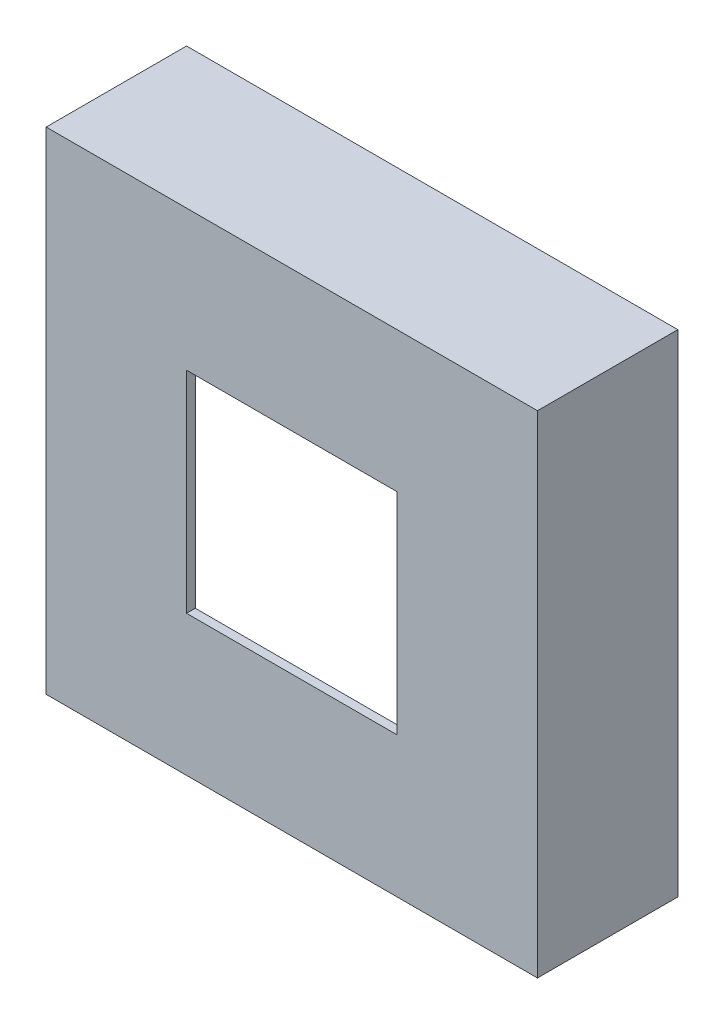
ISO-10303-21;
HEADER;
FILE_DESCRIPTION(('STEP AP214'),'2;1');
FILE_NAME('part.step','',(''),(''),'','','');
FILE_SCHEMA(('AUTOMOTIVE_DESIGN { 1 0 10303 214 1 1 1 1 }'));
ENDSEC;
DATA;
#1=APPLICATION_CONTEXT('core data for automotive mechanical design processes');
#2=APPLICATION_PROTOCOL_DEFINITION('international standard','automotive_design',2000,#1);
#3=PRODUCT_CONTEXT('',#1,'mechanical');
#4=PRODUCT('Part','Part','',(#3));
#5=PRODUCT_RELATED_PRODUCT_CATEGORY('part','',(#4));
#6=PRODUCT_DEFINITION_FORMATION('','',#4);
#7=PRODUCT_DEFINITION_CONTEXT('part definition',#1,'design');
#8=PRODUCT_DEFINITION('design','',#6,#7);
#9=PRODUCT_DEFINITION_SHAPE('','',#8);
#10=(LENGTH_UNIT() NAMED_UNIT(*) SI_UNIT(.MILLI.,.METRE.));
#11=(NAMED_UNIT(*) PLANE_ANGLE_UNIT() SI_UNIT($,.RADIAN.));
#12=(NAMED_UNIT(*) SI_UNIT($,.STERADIAN.) SOLID_ANGLE_UNIT());
#13=UNCERTAINTY_MEASURE_WITH_UNIT(LENGTH_MEASURE(1.E-05),#10,'distance_accuracy_value','');
#14=(GEOMETRIC_REPRESENTATION_CONTEXT(3) GLOBAL_UNCERTAINTY_ASSIGNED_CONTEXT((#13)) GLOBAL_UNIT_ASSIGNED_CONTEXT((#10,
#11,#12)) REPRESENTATION_CONTEXT('',''));
#15=CARTESIAN_POINT('',(0.,0.,0.));
#16=DIRECTION('',(0.,0.,1.));
#17=DIRECTION('',(1.,0.,0.));
#18=AXIS2_PLACEMENT_3D('',#15,#16,#17);
#19=CARTESIAN_POINT('',(0.,0.,0.));
#20=DIRECTION('',(0.,0.,1.));
#21=DIRECTION('',(1.,0.,0.));
#22=AXIS2_PLACEMENT_3D('',#19,#20,#21);
#23=PLANE('',#22);
#24=DIRECTION('',(1.,0.,0.));
#25=VECTOR('',#24,1.);
#26=CARTESIAN_POINT('',(-1.,-1.,0.));
#27=LINE('',#26,#25);
#28=CARTESIAN_POINT('',(-1.,-1.,0.));
#29=VERTEX_POINT('',#28);
#30=CARTESIAN_POINT('',(55.,-1.,0.));
#31=VERTEX_POINT('',#30);
#32=EDGE_CURVE('E241',#29,#31,#27,.T.);
#33=ORIENTED_EDGE('',*,*,#32,.F.);
#34=DIRECTION('',(0.,-1.,0.));
#35=VECTOR('',#34,1.);
#36=CARTESIAN_POINT('',(-1.,-1.,0.));
#37=LINE('',#36,#35);
#38=CARTESIAN_POINT('',(-1.,55.,0.));
#39=VERTEX_POINT('',#38);
#40=EDGE_CURVE('E251',#39,#29,#37,.T.);
#41=ORIENTED_EDGE('',*,*,#40,.F.);
#42=DIRECTION('',(-1.,0.,0.));
#43=VECTOR('',#42,1.);
#44=CARTESIAN_POINT('',(-1.,55.,0.));
#45=LINE('',#44,#43);
#46=CARTESIAN_POINT('',(55.,55.,0.));
#47=VERTEX_POINT('',#46);
#48=EDGE_CURVE('E248',#47,#39,#45,.T.);
#49=ORIENTED_EDGE('',*,*,#48,.F.);
#50=DIRECTION('',(0.,1.,0.));
#51=VECTOR('',#50,1.);
#52=CARTESIAN_POINT('',(55.,-1.,0.));
#53=LINE('',#52,#51);
#54=EDGE_CURVE('E245',#31,#47,#53,.T.);
#55=ORIENTED_EDGE('',*,*,#54,.F.);
#56=EDGE_LOOP('',(#33,#41,#49,#55));
#57=FACE_BOUND('',#56,.T.);
#58=DIRECTION('',(0.,-1.,0.));
#59=VECTOR('',#58,1.);
#60=CARTESIAN_POINT('',(0.,0.,0.));
#61=LINE('',#60,#59);
#62=CARTESIAN_POINT('',(0.,54.,0.));
#63=VERTEX_POINT('',#62);
#64=CARTESIAN_POINT('',(0.,0.,0.));
#65=VERTEX_POINT('',#64);
#66=EDGE_CURVE('E63',#63,#65,#61,.T.);
#67=ORIENTED_EDGE('',*,*,#66,.T.);
#68=DIRECTION('',(1.,0.,0.));
#69=VECTOR('',#68,1.);
#70=CARTESIAN_POINT('',(0.,0.,0.));
#71=LINE('',#70,#69);
#72=CARTESIAN_POINT('',(54.,0.,0.));
#73=VERTEX_POINT('',#72);
#74=EDGE_CURVE('E219',#65,#73,#71,.T.);
#75=ORIENTED_EDGE('',*,*,#74,.T.);
#76=DIRECTION('',(0.,1.,0.));
#77=VECTOR('',#76,1.);
#78=CARTESIAN_POINT('',(54.,0.,0.));
#79=LINE('',#78,#77);
#80=CARTESIAN_POINT('',(54.,54.,0.));
#81=VERTEX_POINT('',#80);
#82=EDGE_CURVE('E223',#73,#81,#79,.T.);
#83=ORIENTED_EDGE('',*,*,#82,.T.);
#84=DIRECTION('',(-1.,0.,0.));
#85=VECTOR('',#84,1.);
#86=CARTESIAN_POINT('',(0.,54.,0.));
#87=LINE('',#86,#85);
#88=EDGE_CURVE('E206',#81,#63,#87,.T.);
#89=ORIENTED_EDGE('',*,*,#88,.T.);
#90=EDGE_LOOP('',(#67,#75,#83,#89));
#91=FACE_BOUND('',#90,.T.);
#92=ADVANCED_FACE('F39',(#57,#91),#23,.F.);
#93=CARTESIAN_POINT('',(-1.,-1.,15.));
#94=DIRECTION('',(0.,1.,0.));
#95=DIRECTION('',(0.,0.,1.));
#96=AXIS2_PLACEMENT_3D('',#93,#94,#95);
#97=PLANE('',#96);
#98=ORIENTED_EDGE('',*,*,#32,.T.);
#99=DIRECTION('',(0.,0.,-1.));
#100=VECTOR('',#99,1.);
#101=CARTESIAN_POINT('',(55.,-1.,15.));
#102=LINE('',#101,#100);
#103=CARTESIAN_POINT('',(55.,-1.,16.));
#104=VERTEX_POINT('',#103);
#105=EDGE_CURVE('E11',#104,#31,#102,.T.);
#106=ORIENTED_EDGE('',*,*,#105,.F.);
#107=DIRECTION('',(1.,0.,0.));
#108=VECTOR('',#107,1.);
#109=CARTESIAN_POINT('',(-1.,-1.,16.));
#110=LINE('',#109,#108);
#111=CARTESIAN_POINT('',(-1.,-1.,16.));
#112=VERTEX_POINT('',#111);
#113=EDGE_CURVE('E189',#112,#104,#110,.T.);
#114=ORIENTED_EDGE('',*,*,#113,.F.);
#115=DIRECTION('',(0.,0.,-1.));
#116=VECTOR('',#115,1.);
#117=CARTESIAN_POINT('',(-1.,-1.,15.));
#118=LINE('',#117,#116);
#119=EDGE_CURVE('E254',#112,#29,#118,.T.);
#120=ORIENTED_EDGE('',*,*,#119,.T.);
#121=EDGE_LOOP('',(#98,#106,#114,#120));
#122=FACE_BOUND('',#121,.T.);
#123=ADVANCED_FACE('F41',(#122),#97,.F.);
#124=CARTESIAN_POINT('',(55.,-1.,15.));
#125=DIRECTION('',(-1.,0.,0.));
#126=DIRECTION('',(0.,-1.,0.));
#127=AXIS2_PLACEMENT_3D('',#124,#125,#126);
#128=PLANE('',#127);
#129=ORIENTED_EDGE('',*,*,#54,.T.);
#130=DIRECTION('',(0.,0.,-1.));
#131=VECTOR('',#130,1.);
#132=CARTESIAN_POINT('',(55.,55.,15.));
#133=LINE('',#132,#131);
#134=CARTESIAN_POINT('',(55.,55.,16.));
#135=VERTEX_POINT('',#134);
#136=EDGE_CURVE('E48',#135,#47,#133,.T.);
#137=ORIENTED_EDGE('',*,*,#136,.F.);
#138=DIRECTION('',(0.,1.,0.));
#139=VECTOR('',#138,1.);
#140=CARTESIAN_POINT('',(55.,55.,16.));
#141=LINE('',#140,#139);
#142=EDGE_CURVE('E193',#104,#135,#141,.T.);
#143=ORIENTED_EDGE('',*,*,#142,.F.);
#144=ORIENTED_EDGE('',*,*,#105,.T.);
#145=EDGE_LOOP('',(#129,#137,#143,#144));
#146=FACE_BOUND('',#145,.T.);
#147=ADVANCED_FACE('F279',(#146),#128,.F.);
#148=CARTESIAN_POINT('',(-1.,55.,15.));
#149=DIRECTION('',(0.,-1.,0.));
#150=DIRECTION('',(0.,0.,-1.));
#151=AXIS2_PLACEMENT_3D('',#148,#149,#150);
#152=PLANE('',#151);
#153=ORIENTED_EDGE('',*,*,#48,.T.);
#154=DIRECTION('',(0.,0.,-1.));
#155=VECTOR('',#154,1.);
#156=CARTESIAN_POINT('',(-1.,55.,15.));
#157=LINE('',#156,#155);
#158=CARTESIAN_POINT('',(-1.,55.,16.));
#159=VERTEX_POINT('',#158);
#160=EDGE_CURVE('E258',#159,#39,#157,.T.);
#161=ORIENTED_EDGE('',*,*,#160,.F.);
#162=DIRECTION('',(-1.,0.,0.));
#163=VECTOR('',#162,1.);
#164=CARTESIAN_POINT('',(-1.,55.,16.));
#165=LINE('',#164,#163);
#166=EDGE_CURVE('E197',#135,#159,#165,.T.);
#167=ORIENTED_EDGE('',*,*,#166,.F.);
#168=ORIENTED_EDGE('',*,*,#136,.T.);
#169=EDGE_LOOP('',(#153,#161,#167,#168));
#170=FACE_BOUND('',#169,.T.);
#171=ADVANCED_FACE('F266',(#170),#152,.F.);
#172=CARTESIAN_POINT('',(-1.,-1.,15.));
#173=DIRECTION('',(1.,0.,0.));
#174=DIRECTION('',(0.,0.,-1.));
#175=AXIS2_PLACEMENT_3D('',#172,#173,#174);
#176=PLANE('',#175);
#177=ORIENTED_EDGE('',*,*,#40,.T.);
#178=ORIENTED_EDGE('',*,*,#119,.F.);
#179=DIRECTION('',(0.,-1.,0.));
#180=VECTOR('',#179,1.);
#181=CARTESIAN_POINT('',(-1.,55.,16.));
#182=LINE('',#181,#180);
#183=EDGE_CURVE('E152',#159,#112,#182,.T.);
#184=ORIENTED_EDGE('',*,*,#183,.F.);
#185=ORIENTED_EDGE('',*,*,#160,.T.);
#186=EDGE_LOOP('',(#177,#178,#184,#185));
#187=FACE_BOUND('',#186,.T.);
#188=ADVANCED_FACE('F274',(#187),#176,.F.);
#189=CARTESIAN_POINT('',(0.,0.,15.));
#190=DIRECTION('',(1.,0.,0.));
#191=DIRECTION('',(0.,0.,-1.));
#192=AXIS2_PLACEMENT_3D('',#189,#190,#191);
#193=PLANE('',#192);
#194=ORIENTED_EDGE('',*,*,#66,.F.);
#195=DIRECTION('',(0.,0.,-1.));
#196=VECTOR('',#195,1.);
#197=CARTESIAN_POINT('',(0.,54.,15.));
#198=LINE('',#197,#196);
#199=CARTESIAN_POINT('',(0.,54.,15.));
#200=VERTEX_POINT('',#199);
#201=EDGE_CURVE('E216',#200,#63,#198,.T.);
#202=ORIENTED_EDGE('',*,*,#201,.F.);
#203=DIRECTION('',(0.,-1.,0.));
#204=VECTOR('',#203,1.);
#205=CARTESIAN_POINT('',(0.,0.,15.));
#206=LINE('',#205,#204);
#207=CARTESIAN_POINT('',(0.,0.,15.));
#208=VERTEX_POINT('',#207);
#209=EDGE_CURVE('E201',#200,#208,#206,.T.);
#210=ORIENTED_EDGE('',*,*,#209,.T.);
#211=DIRECTION('',(0.,0.,-1.));
#212=VECTOR('',#211,1.);
#213=CARTESIAN_POINT('',(0.,0.,15.));
#214=LINE('',#213,#212);
#215=EDGE_CURVE('E238',#208,#65,#214,.T.);
#216=ORIENTED_EDGE('',*,*,#215,.T.);
#217=EDGE_LOOP('',(#194,#202,#210,#216));
#218=FACE_BOUND('',#217,.T.);
#219=ADVANCED_FACE('F292',(#218),#193,.T.);
#220=CARTESIAN_POINT('',(0.,0.,15.));
#221=DIRECTION('',(0.,1.,0.));
#222=DIRECTION('',(0.,0.,1.));
#223=AXIS2_PLACEMENT_3D('',#220,#221,#222);
#224=PLANE('',#223);
#225=ORIENTED_EDGE('',*,*,#74,.F.);
#226=ORIENTED_EDGE('',*,*,#215,.F.);
#227=DIRECTION('',(1.,0.,0.));
#228=VECTOR('',#227,1.);
#229=CARTESIAN_POINT('',(0.,0.,15.));
#230=LINE('',#229,#228);
#231=CARTESIAN_POINT('',(54.,0.,15.));
#232=VERTEX_POINT('',#231);
#233=EDGE_CURVE('E205',#208,#232,#230,.T.);
#234=ORIENTED_EDGE('',*,*,#233,.T.);
#235=DIRECTION('',(0.,0.,-1.));
#236=VECTOR('',#235,1.);
#237=CARTESIAN_POINT('',(54.,0.,15.));
#238=LINE('',#237,#236);
#239=EDGE_CURVE('E235',#232,#73,#238,.T.);
#240=ORIENTED_EDGE('',*,*,#239,.T.);
#241=EDGE_LOOP('',(#225,#226,#234,#240));
#242=FACE_BOUND('',#241,.T.);
#243=ADVANCED_FACE('F298',(#242),#224,.T.);
#244=CARTESIAN_POINT('',(54.,0.,15.));
#245=DIRECTION('',(-1.,0.,0.));
#246=DIRECTION('',(0.,0.,1.));
#247=AXIS2_PLACEMENT_3D('',#244,#245,#246);
#248=PLANE('',#247);
#249=ORIENTED_EDGE('',*,*,#82,.F.);
#250=ORIENTED_EDGE('',*,*,#239,.F.);
#251=DIRECTION('',(0.,1.,0.));
#252=VECTOR('',#251,1.);
#253=CARTESIAN_POINT('',(54.,0.,15.));
#254=LINE('',#253,#252);
#255=CARTESIAN_POINT('',(54.,54.,15.));
#256=VERTEX_POINT('',#255);
#257=EDGE_CURVE('E210',#232,#256,#254,.T.);
#258=ORIENTED_EDGE('',*,*,#257,.T.);
#259=DIRECTION('',(0.,0.,-1.));
#260=VECTOR('',#259,1.);
#261=CARTESIAN_POINT('',(54.,54.,15.));
#262=LINE('',#261,#260);
#263=EDGE_CURVE('E232',#256,#81,#262,.T.);
#264=ORIENTED_EDGE('',*,*,#263,.T.);
#265=EDGE_LOOP('',(#249,#250,#258,#264));
#266=FACE_BOUND('',#265,.T.);
#267=ADVANCED_FACE('F302',(#266),#248,.T.);
#268=CARTESIAN_POINT('',(0.,54.,15.));
#269=DIRECTION('',(0.,-1.,0.));
#270=DIRECTION('',(0.,0.,-1.));
#271=AXIS2_PLACEMENT_3D('',#268,#269,#270);
#272=PLANE('',#271);
#273=ORIENTED_EDGE('',*,*,#88,.F.);
#274=ORIENTED_EDGE('',*,*,#263,.F.);
#275=DIRECTION('',(-1.,0.,0.));
#276=VECTOR('',#275,1.);
#277=CARTESIAN_POINT('',(0.,54.,15.));
#278=LINE('',#277,#276);
#279=EDGE_CURVE('E55',#256,#200,#278,.T.);
#280=ORIENTED_EDGE('',*,*,#279,.T.);
#281=ORIENTED_EDGE('',*,*,#201,.T.);
#282=EDGE_LOOP('',(#273,#274,#280,#281));
#283=FACE_BOUND('',#282,.T.);
#284=ADVANCED_FACE('F307',(#283),#272,.T.);
#285=CARTESIAN_POINT('',(0.,0.,16.));
#286=DIRECTION('',(0.,0.,1.));
#287=DIRECTION('',(1.,0.,0.));
#288=AXIS2_PLACEMENT_3D('',#285,#286,#287);
#289=PLANE('',#288);
#290=ORIENTED_EDGE('',*,*,#183,.T.);
#291=ORIENTED_EDGE('',*,*,#113,.T.);
#292=ORIENTED_EDGE('',*,*,#142,.T.);
#293=ORIENTED_EDGE('',*,*,#166,.T.);
#294=EDGE_LOOP('',(#290,#291,#292,#293));
#295=FACE_BOUND('',#294,.T.);
#296=DIRECTION('',(1.,0.,0.));
#297=VECTOR('',#296,1.);
#298=CARTESIAN_POINT('',(39.,15.,16.));
#299=LINE('',#298,#297);
#300=CARTESIAN_POINT('',(15.,15.,16.));
#301=VERTEX_POINT('',#300);
#302=CARTESIAN_POINT('',(39.,15.,16.));
#303=VERTEX_POINT('',#302);
#304=EDGE_CURVE('E143',#301,#303,#299,.T.);
#305=ORIENTED_EDGE('',*,*,#304,.F.);
#306=DIRECTION('',(0.,-1.,0.));
#307=VECTOR('',#306,1.);
#308=CARTESIAN_POINT('',(15.,15.,16.));
#309=LINE('',#308,#307);
#310=CARTESIAN_POINT('',(15.,39.,16.));
#311=VERTEX_POINT('',#310);
#312=EDGE_CURVE('E132',#311,#301,#309,.T.);
#313=ORIENTED_EDGE('',*,*,#312,.F.);
#314=DIRECTION('',(-1.,0.,0.));
#315=VECTOR('',#314,1.);
#316=CARTESIAN_POINT('',(39.,39.,16.));
#317=LINE('',#316,#315);
#318=CARTESIAN_POINT('',(39.,39.,16.));
#319=VERTEX_POINT('',#318);
#320=EDGE_CURVE('E162',#319,#311,#317,.T.);
#321=ORIENTED_EDGE('',*,*,#320,.F.);
#322=DIRECTION('',(0.,1.,0.));
#323=VECTOR('',#322,1.);
#324=CARTESIAN_POINT('',(39.,15.,16.));
#325=LINE('',#324,#323);
#326=EDGE_CURVE('E158',#303,#319,#325,.T.);
#327=ORIENTED_EDGE('',*,*,#326,.F.);
#328=EDGE_LOOP('',(#305,#313,#321,#327));
#329=FACE_BOUND('',#328,.T.);
#330=ADVANCED_FACE('F156',(#295,#329),#289,.T.);
#331=CARTESIAN_POINT('',(0.,0.,15.));
#332=DIRECTION('',(0.,0.,1.));
#333=DIRECTION('',(1.,0.,0.));
#334=AXIS2_PLACEMENT_3D('',#331,#332,#333);
#335=PLANE('',#334);
#336=ORIENTED_EDGE('',*,*,#233,.F.);
#337=ORIENTED_EDGE('',*,*,#209,.F.);
#338=ORIENTED_EDGE('',*,*,#279,.F.);
#339=ORIENTED_EDGE('',*,*,#257,.F.);
#340=EDGE_LOOP('',(#336,#337,#338,#339));
#341=FACE_BOUND('',#340,.T.);
#342=DIRECTION('',(0.,-1.,0.));
#343=VECTOR('',#342,1.);
#344=CARTESIAN_POINT('',(15.,15.,15.));
#345=LINE('',#344,#343);
#346=CARTESIAN_POINT('',(15.,39.,15.));
#347=VERTEX_POINT('',#346);
#348=CARTESIAN_POINT('',(15.,15.,15.));
#349=VERTEX_POINT('',#348);
#350=EDGE_CURVE('E167',#347,#349,#345,.T.);
#351=ORIENTED_EDGE('',*,*,#350,.T.);
#352=DIRECTION('',(1.,0.,0.));
#353=VECTOR('',#352,1.);
#354=CARTESIAN_POINT('',(39.,15.,15.));
#355=LINE('',#354,#353);
#356=CARTESIAN_POINT('',(39.,15.,15.));
#357=VERTEX_POINT('',#356);
#358=EDGE_CURVE('E150',#349,#357,#355,.T.);
#359=ORIENTED_EDGE('',*,*,#358,.T.);
#360=DIRECTION('',(0.,1.,0.));
#361=VECTOR('',#360,1.);
#362=CARTESIAN_POINT('',(39.,15.,15.));
#363=LINE('',#362,#361);
#364=CARTESIAN_POINT('',(39.,39.,15.));
#365=VERTEX_POINT('',#364);
#366=EDGE_CURVE('E172',#357,#365,#363,.T.);
#367=ORIENTED_EDGE('',*,*,#366,.T.);
#368=DIRECTION('',(-1.,0.,0.));
#369=VECTOR('',#368,1.);
#370=CARTESIAN_POINT('',(39.,39.,15.));
#371=LINE('',#370,#369);
#372=EDGE_CURVE('E144',#365,#347,#371,.T.);
#373=ORIENTED_EDGE('',*,*,#372,.T.);
#374=EDGE_LOOP('',(#351,#359,#367,#373));
#375=FACE_BOUND('',#374,.T.);
#376=ADVANCED_FACE('F314',(#341,#375),#335,.F.);
#377=CARTESIAN_POINT('',(15.,15.,16.));
#378=DIRECTION('',(1.,0.,0.));
#379=DIRECTION('',(0.,0.,-1.));
#380=AXIS2_PLACEMENT_3D('',#377,#378,#379);
#381=PLANE('',#380);
#382=ORIENTED_EDGE('',*,*,#350,.F.);
#383=DIRECTION('',(0.,0.,-1.));
#384=VECTOR('',#383,1.);
#385=CARTESIAN_POINT('',(15.,39.,16.));
#386=LINE('',#385,#384);
#387=EDGE_CURVE('E138',#311,#347,#386,.T.);
#388=ORIENTED_EDGE('',*,*,#387,.F.);
#389=ORIENTED_EDGE('',*,*,#312,.T.);
#390=DIRECTION('',(0.,0.,-1.));
#391=VECTOR('',#390,1.);
#392=CARTESIAN_POINT('',(15.,15.,16.));
#393=LINE('',#392,#391);
#394=EDGE_CURVE('E135',#301,#349,#393,.T.);
#395=ORIENTED_EDGE('',*,*,#394,.T.);
#396=EDGE_LOOP('',(#382,#388,#389,#395));
#397=FACE_BOUND('',#396,.T.);
#398=ADVANCED_FACE('F134',(#397),#381,.T.);
#399=CARTESIAN_POINT('',(39.,15.,16.));
#400=DIRECTION('',(0.,1.,0.));
#401=DIRECTION('',(0.,0.,1.));
#402=AXIS2_PLACEMENT_3D('',#399,#400,#401);
#403=PLANE('',#402);
#404=ORIENTED_EDGE('',*,*,#358,.F.);
#405=ORIENTED_EDGE('',*,*,#394,.F.);
#406=ORIENTED_EDGE('',*,*,#304,.T.);
#407=DIRECTION('',(0.,0.,-1.));
#408=VECTOR('',#407,1.);
#409=CARTESIAN_POINT('',(39.,15.,16.));
#410=LINE('',#409,#408);
#411=EDGE_CURVE('E153',#303,#357,#410,.T.);
#412=ORIENTED_EDGE('',*,*,#411,.T.);
#413=EDGE_LOOP('',(#404,#405,#406,#412));
#414=FACE_BOUND('',#413,.T.);
#415=ADVANCED_FACE('F147',(#414),#403,.T.);
#416=CARTESIAN_POINT('',(39.,15.,16.));
#417=DIRECTION('',(-1.,0.,0.));
#418=DIRECTION('',(0.,0.,1.));
#419=AXIS2_PLACEMENT_3D('',#416,#417,#418);
#420=PLANE('',#419);
#421=ORIENTED_EDGE('',*,*,#366,.F.);
#422=ORIENTED_EDGE('',*,*,#411,.F.);
#423=ORIENTED_EDGE('',*,*,#326,.T.);
#424=DIRECTION('',(0.,0.,-1.));
#425=VECTOR('',#424,1.);
#426=CARTESIAN_POINT('',(39.,39.,16.));
#427=LINE('',#426,#425);
#428=EDGE_CURVE('E181',#319,#365,#427,.T.);
#429=ORIENTED_EDGE('',*,*,#428,.T.);
#430=EDGE_LOOP('',(#421,#422,#423,#429));
#431=FACE_BOUND('',#430,.T.);
#432=ADVANCED_FACE('F323',(#431),#420,.T.);
#433=CARTESIAN_POINT('',(39.,39.,16.));
#434=DIRECTION('',(0.,-1.,0.));
#435=DIRECTION('',(0.,0.,-1.));
#436=AXIS2_PLACEMENT_3D('',#433,#434,#435);
#437=PLANE('',#436);
#438=ORIENTED_EDGE('',*,*,#372,.F.);
#439=ORIENTED_EDGE('',*,*,#428,.F.);
#440=ORIENTED_EDGE('',*,*,#320,.T.);
#441=ORIENTED_EDGE('',*,*,#387,.T.);
#442=EDGE_LOOP('',(#438,#439,#440,#441));
#443=FACE_BOUND('',#442,.T.);
#444=ADVANCED_FACE('F326',(#443),#437,.T.);
#445=CLOSED_SHELL('',(#92,#123,#147,#171,#188,#219,#243,#267,#284,#330,#376,#398,#415,#432,#444));
#446=MANIFOLD_SOLID_BREP('B2',#445);
#447=ADVANCED_BREP_SHAPE_REPRESENTATION('',(#18,#446),#14);
#448=SHAPE_DEFINITION_REPRESENTATION(#9,#447);
ENDSEC;
END-ISO-10303-21;
